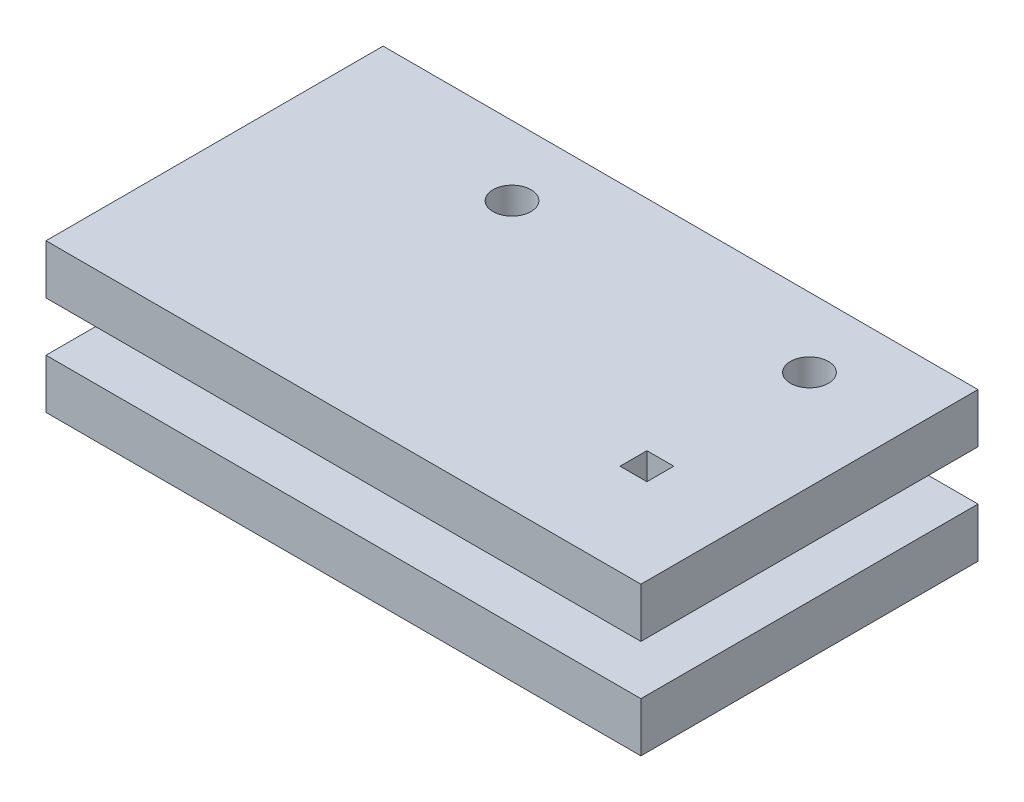
ISO-10303-21;
HEADER;
FILE_DESCRIPTION(('STEP AP214'),'2;1');
FILE_NAME('part.step','',(''),(''),'','','');
FILE_SCHEMA(('AUTOMOTIVE_DESIGN { 1 0 10303 214 1 1 1 1 }'));
ENDSEC;
DATA;
#1=APPLICATION_CONTEXT('core data for automotive mechanical design processes');
#2=APPLICATION_PROTOCOL_DEFINITION('international standard','automotive_design',2000,#1);
#3=PRODUCT_CONTEXT('',#1,'mechanical');
#4=PRODUCT('Part','Part','',(#3));
#5=PRODUCT_RELATED_PRODUCT_CATEGORY('part','',(#4));
#6=PRODUCT_DEFINITION_FORMATION('','',#4);
#7=PRODUCT_DEFINITION_CONTEXT('part definition',#1,'design');
#8=PRODUCT_DEFINITION('design','',#6,#7);
#9=PRODUCT_DEFINITION_SHAPE('','',#8);
#10=(LENGTH_UNIT() NAMED_UNIT(*) SI_UNIT(.MILLI.,.METRE.));
#11=(NAMED_UNIT(*) PLANE_ANGLE_UNIT() SI_UNIT($,.RADIAN.));
#12=(NAMED_UNIT(*) SI_UNIT($,.STERADIAN.) SOLID_ANGLE_UNIT());
#13=UNCERTAINTY_MEASURE_WITH_UNIT(LENGTH_MEASURE(1.E-05),#10,'distance_accuracy_value','');
#14=(GEOMETRIC_REPRESENTATION_CONTEXT(3) GLOBAL_UNCERTAINTY_ASSIGNED_CONTEXT((#13)) GLOBAL_UNIT_ASSIGNED_CONTEXT((#10,
#11,#12)) REPRESENTATION_CONTEXT('',''));
#15=CARTESIAN_POINT('',(0.,0.,0.));
#16=DIRECTION('',(0.,0.,1.));
#17=DIRECTION('',(1.,0.,0.));
#18=AXIS2_PLACEMENT_3D('',#15,#16,#17);
#19=CARTESIAN_POINT('',(38.1,9.525,43.18));
#20=DIRECTION('',(-1.,0.,0.));
#21=DIRECTION('',(0.,-1.,0.));
#22=AXIS2_PLACEMENT_3D('',#19,#20,#21);
#23=PLANE('',#22);
#24=DIRECTION('',(0.,1.,0.));
#25=VECTOR('',#24,1.);
#26=CARTESIAN_POINT('',(38.1,9.525,0.));
#27=LINE('',#26,#25);
#28=CARTESIAN_POINT('',(38.1,-9.525,0.));
#29=VERTEX_POINT('',#28);
#30=CARTESIAN_POINT('',(38.1,-3.175,0.));
#31=VERTEX_POINT('',#30);
#32=EDGE_CURVE('E151',#29,#31,#27,.T.);
#33=ORIENTED_EDGE('',*,*,#32,.T.);
#34=DIRECTION('',(0.,0.,-1.));
#35=VECTOR('',#34,1.);
#36=CARTESIAN_POINT('',(38.1,-3.175,43.18));
#37=LINE('',#36,#35);
#38=CARTESIAN_POINT('',(38.1,-3.175,43.18));
#39=VERTEX_POINT('',#38);
#40=EDGE_CURVE('E166',#39,#31,#37,.T.);
#41=ORIENTED_EDGE('',*,*,#40,.F.);
#42=DIRECTION('',(0.,1.,0.));
#43=VECTOR('',#42,1.);
#44=CARTESIAN_POINT('',(38.1,9.525,43.18));
#45=LINE('',#44,#43);
#46=CARTESIAN_POINT('',(38.1,-9.525,43.18));
#47=VERTEX_POINT('',#46);
#48=EDGE_CURVE('E162',#47,#39,#45,.T.);
#49=ORIENTED_EDGE('',*,*,#48,.F.);
#50=DIRECTION('',(0.,0.,-1.));
#51=VECTOR('',#50,1.);
#52=CARTESIAN_POINT('',(38.1,-9.525,43.18));
#53=LINE('',#52,#51);
#54=EDGE_CURVE('E157',#47,#29,#53,.T.);
#55=ORIENTED_EDGE('',*,*,#54,.T.);
#56=EDGE_LOOP('',(#33,#41,#49,#55));
#57=FACE_BOUND('',#56,.T.);
#58=ADVANCED_FACE('F55',(#57),#23,.F.);
#59=CARTESIAN_POINT('',(-38.1,9.525,43.18));
#60=DIRECTION('',(1.,0.,0.));
#61=DIRECTION('',(0.,1.,0.));
#62=AXIS2_PLACEMENT_3D('',#59,#60,#61);
#63=PLANE('',#62);
#64=DIRECTION('',(0.,-1.,0.));
#65=VECTOR('',#64,1.);
#66=CARTESIAN_POINT('',(-38.1,9.525,43.18));
#67=LINE('',#66,#65);
#68=CARTESIAN_POINT('',(-38.1,-3.175,43.18));
#69=VERTEX_POINT('',#68);
#70=CARTESIAN_POINT('',(-38.1,-9.525,43.18));
#71=VERTEX_POINT('',#70);
#72=EDGE_CURVE('E165',#69,#71,#67,.T.);
#73=ORIENTED_EDGE('',*,*,#72,.F.);
#74=DIRECTION('',(0.,0.,-1.));
#75=VECTOR('',#74,1.);
#76=CARTESIAN_POINT('',(-38.1,-3.175,43.18));
#77=LINE('',#76,#75);
#78=CARTESIAN_POINT('',(-38.1,-3.175,0.));
#79=VERTEX_POINT('',#78);
#80=EDGE_CURVE('E160',#69,#79,#77,.T.);
#81=ORIENTED_EDGE('',*,*,#80,.T.);
#82=DIRECTION('',(0.,-1.,0.));
#83=VECTOR('',#82,1.);
#84=CARTESIAN_POINT('',(-38.1,9.525,0.));
#85=LINE('',#84,#83);
#86=CARTESIAN_POINT('',(-38.1,-9.525,0.));
#87=VERTEX_POINT('',#86);
#88=EDGE_CURVE('E171',#79,#87,#85,.T.);
#89=ORIENTED_EDGE('',*,*,#88,.T.);
#90=DIRECTION('',(0.,0.,-1.));
#91=VECTOR('',#90,1.);
#92=CARTESIAN_POINT('',(-38.1,-9.525,43.18));
#93=LINE('',#92,#91);
#94=EDGE_CURVE('E152',#71,#87,#93,.T.);
#95=ORIENTED_EDGE('',*,*,#94,.F.);
#96=EDGE_LOOP('',(#73,#81,#89,#95));
#97=FACE_BOUND('',#96,.T.);
#98=ADVANCED_FACE('F214',(#97),#63,.F.);
#99=CARTESIAN_POINT('',(0.,0.,43.18));
#100=DIRECTION('',(0.,0.,1.));
#101=DIRECTION('',(1.,0.,0.));
#102=AXIS2_PLACEMENT_3D('',#99,#100,#101);
#103=PLANE('',#102);
#104=DIRECTION('',(-1.,0.,0.));
#105=VECTOR('',#104,1.);
#106=CARTESIAN_POINT('',(38.1,-3.175,43.18));
#107=LINE('',#106,#105);
#108=EDGE_CURVE('E173',#39,#69,#107,.T.);
#109=ORIENTED_EDGE('',*,*,#108,.T.);
#110=ORIENTED_EDGE('',*,*,#72,.T.);
#111=DIRECTION('',(1.,0.,0.));
#112=VECTOR('',#111,1.);
#113=CARTESIAN_POINT('',(-38.1,-9.525,43.18));
#114=LINE('',#113,#112);
#115=EDGE_CURVE('E163',#71,#47,#114,.T.);
#116=ORIENTED_EDGE('',*,*,#115,.T.);
#117=ORIENTED_EDGE('',*,*,#48,.T.);
#118=EDGE_LOOP('',(#109,#110,#116,#117));
#119=FACE_BOUND('',#118,.T.);
#120=ADVANCED_FACE('F209',(#119),#103,.T.);
#121=CARTESIAN_POINT('',(0.,0.,0.));
#122=DIRECTION('',(0.,0.,1.));
#123=DIRECTION('',(1.,0.,0.));
#124=AXIS2_PLACEMENT_3D('',#121,#122,#123);
#125=PLANE('',#124);
#126=ORIENTED_EDGE('',*,*,#88,.F.);
#127=DIRECTION('',(-1.,0.,0.));
#128=VECTOR('',#127,1.);
#129=CARTESIAN_POINT('',(38.1,-3.175,0.));
#130=LINE('',#129,#128);
#131=EDGE_CURVE('E155',#31,#79,#130,.T.);
#132=ORIENTED_EDGE('',*,*,#131,.F.);
#133=ORIENTED_EDGE('',*,*,#32,.F.);
#134=DIRECTION('',(1.,0.,0.));
#135=VECTOR('',#134,1.);
#136=CARTESIAN_POINT('',(-38.1,-9.525,0.));
#137=LINE('',#136,#135);
#138=EDGE_CURVE('E156',#87,#29,#137,.T.);
#139=ORIENTED_EDGE('',*,*,#138,.F.);
#140=EDGE_LOOP('',(#126,#132,#133,#139));
#141=FACE_BOUND('',#140,.T.);
#142=ADVANCED_FACE('F199',(#141),#125,.F.);
#143=CARTESIAN_POINT('',(-38.1,-9.525,43.18));
#144=DIRECTION('',(0.,1.,0.));
#145=DIRECTION('',(0.,0.,1.));
#146=AXIS2_PLACEMENT_3D('',#143,#144,#145);
#147=PLANE('',#146);
#148=CARTESIAN_POINT('',(25.4,-9.525,8.89000000000003));
#149=DIRECTION('',(0.,1.,0.));
#150=DIRECTION('',(0.,0.,1.));
#151=AXIS2_PLACEMENT_3D('',#148,#149,#150);
#152=CIRCLE('',#151,2.434895054);
#153=CARTESIAN_POINT('',(25.4,-9.525,6.45510494600003));
#154=VERTEX_POINT('',#153);
#155=EDGE_CURVE('E148',#154,#154,#152,.T.);
#156=ORIENTED_EDGE('',*,*,#155,.T.);
#157=EDGE_LOOP('',(#156));
#158=FACE_BOUND('',#157,.T.);
#159=CARTESIAN_POINT('',(-12.7,-9.525,8.89000000000003));
#160=DIRECTION('',(0.,1.,0.));
#161=DIRECTION('',(0.,0.,1.));
#162=AXIS2_PLACEMENT_3D('',#159,#160,#161);
#163=CIRCLE('',#162,2.434895054);
#164=CARTESIAN_POINT('',(-12.7,-9.525,6.45510494600003));
#165=VERTEX_POINT('',#164);
#166=EDGE_CURVE('E145',#165,#165,#163,.T.);
#167=ORIENTED_EDGE('',*,*,#166,.T.);
#168=EDGE_LOOP('',(#167));
#169=FACE_BOUND('',#168,.T.);
#170=DIRECTION('',(1.,0.,0.));
#171=VECTOR('',#170,1.);
#172=CARTESIAN_POINT('',(-38.1,-9.525,31.4294513951733));
#173=LINE('',#172,#171);
#174=CARTESIAN_POINT('',(23.6782693754441,-9.52499999999999,31.4294513951733));
#175=VERTEX_POINT('',#174);
#176=CARTESIAN_POINT('',(27.1217306245559,-9.525,31.4294513951733));
#177=VERTEX_POINT('',#176);
#178=EDGE_CURVE('E118',#175,#177,#173,.T.);
#179=ORIENTED_EDGE('',*,*,#178,.T.);
#180=DIRECTION('',(0.,0.,-1.));
#181=VECTOR('',#180,1.);
#182=CARTESIAN_POINT('',(27.1217306245559,-9.525,43.18));
#183=LINE('',#182,#181);
#184=CARTESIAN_POINT('',(27.1217306245559,-9.52499999999999,27.9859901460616));
#185=VERTEX_POINT('',#184);
#186=EDGE_CURVE('E139',#177,#185,#183,.T.);
#187=ORIENTED_EDGE('',*,*,#186,.T.);
#188=DIRECTION('',(-1.,0.,0.));
#189=VECTOR('',#188,1.);
#190=CARTESIAN_POINT('',(-38.1,-9.525,27.9859901460616));
#191=LINE('',#190,#189);
#192=CARTESIAN_POINT('',(23.6782693754441,-9.52499999999999,27.9859901460616));
#193=VERTEX_POINT('',#192);
#194=EDGE_CURVE('E137',#185,#193,#191,.T.);
#195=ORIENTED_EDGE('',*,*,#194,.T.);
#196=DIRECTION('',(0.,0.,1.));
#197=VECTOR('',#196,1.);
#198=CARTESIAN_POINT('',(23.6782693754441,-9.525,43.18));
#199=LINE('',#198,#197);
#200=EDGE_CURVE('E123',#193,#175,#199,.T.);
#201=ORIENTED_EDGE('',*,*,#200,.T.);
#202=EDGE_LOOP('',(#179,#187,#195,#201));
#203=FACE_BOUND('',#202,.T.);
#204=ORIENTED_EDGE('',*,*,#138,.T.);
#205=ORIENTED_EDGE('',*,*,#54,.F.);
#206=ORIENTED_EDGE('',*,*,#115,.F.);
#207=ORIENTED_EDGE('',*,*,#94,.T.);
#208=EDGE_LOOP('',(#204,#205,#206,#207));
#209=FACE_BOUND('',#208,.T.);
#210=ADVANCED_FACE('F135',(#158,#169,#203,#209),#147,.F.);
#211=CARTESIAN_POINT('',(38.1,-3.175,43.18));
#212=DIRECTION('',(0.,-1.,0.));
#213=DIRECTION('',(0.,0.,-1.));
#214=AXIS2_PLACEMENT_3D('',#211,#212,#213);
#215=PLANE('',#214);
#216=CARTESIAN_POINT('',(25.4,-3.175,8.89000000000003));
#217=DIRECTION('',(0.,-1.,0.));
#218=DIRECTION('',(0.,0.,-1.));
#219=AXIS2_PLACEMENT_3D('',#216,#217,#218);
#220=CIRCLE('',#219,2.434895054);
#221=CARTESIAN_POINT('',(25.4,-3.175,6.45510494600003));
#222=VERTEX_POINT('',#221);
#223=EDGE_CURVE('E58',#222,#222,#220,.T.);
#224=ORIENTED_EDGE('',*,*,#223,.T.);
#225=EDGE_LOOP('',(#224));
#226=FACE_BOUND('',#225,.T.);
#227=CARTESIAN_POINT('',(-12.7,-3.175,8.89000000000003));
#228=DIRECTION('',(0.,-1.,0.));
#229=DIRECTION('',(0.,0.,-1.));
#230=AXIS2_PLACEMENT_3D('',#227,#228,#229);
#231=CIRCLE('',#230,2.434895054);
#232=CARTESIAN_POINT('',(-12.7,-3.175,6.45510494600003));
#233=VERTEX_POINT('',#232);
#234=EDGE_CURVE('E144',#233,#233,#231,.T.);
#235=ORIENTED_EDGE('',*,*,#234,.T.);
#236=EDGE_LOOP('',(#235));
#237=FACE_BOUND('',#236,.T.);
#238=DIRECTION('',(1.,0.,0.));
#239=VECTOR('',#238,1.);
#240=CARTESIAN_POINT('',(38.1,-3.175,27.9859901460616));
#241=LINE('',#240,#239);
#242=CARTESIAN_POINT('',(23.6782693754441,-3.175,27.9859901460616));
#243=VERTEX_POINT('',#242);
#244=CARTESIAN_POINT('',(27.1217306245559,-3.175,27.9859901460616));
#245=VERTEX_POINT('',#244);
#246=EDGE_CURVE('E63',#243,#245,#241,.T.);
#247=ORIENTED_EDGE('',*,*,#246,.T.);
#248=DIRECTION('',(0.,0.,1.));
#249=VECTOR('',#248,1.);
#250=CARTESIAN_POINT('',(27.1217306245559,-3.175,43.18));
#251=LINE('',#250,#249);
#252=CARTESIAN_POINT('',(27.1217306245559,-3.175,31.4294513951733));
#253=VERTEX_POINT('',#252);
#254=EDGE_CURVE('E12',#245,#253,#251,.T.);
#255=ORIENTED_EDGE('',*,*,#254,.T.);
#256=DIRECTION('',(-1.,0.,0.));
#257=VECTOR('',#256,1.);
#258=CARTESIAN_POINT('',(38.1,-3.175,31.4294513951733));
#259=LINE('',#258,#257);
#260=CARTESIAN_POINT('',(23.6782693754441,-3.175,31.4294513951733));
#261=VERTEX_POINT('',#260);
#262=EDGE_CURVE('E168',#253,#261,#259,.T.);
#263=ORIENTED_EDGE('',*,*,#262,.T.);
#264=DIRECTION('',(0.,0.,-1.));
#265=VECTOR('',#264,1.);
#266=CARTESIAN_POINT('',(23.6782693754441,-3.175,43.18));
#267=LINE('',#266,#265);
#268=EDGE_CURVE('E130',#261,#243,#267,.T.);
#269=ORIENTED_EDGE('',*,*,#268,.T.);
#270=EDGE_LOOP('',(#247,#255,#263,#269));
#271=FACE_BOUND('',#270,.T.);
#272=ORIENTED_EDGE('',*,*,#131,.T.);
#273=ORIENTED_EDGE('',*,*,#80,.F.);
#274=ORIENTED_EDGE('',*,*,#108,.F.);
#275=ORIENTED_EDGE('',*,*,#40,.T.);
#276=EDGE_LOOP('',(#272,#273,#274,#275));
#277=FACE_BOUND('',#276,.T.);
#278=ADVANCED_FACE('F188',(#226,#237,#271,#277),#215,.F.);
#279=CARTESIAN_POINT('',(27.1217306245559,9.525,27.9859901460616));
#280=DIRECTION('',(1.,0.,0.));
#281=DIRECTION('',(0.,0.,-1.));
#282=AXIS2_PLACEMENT_3D('',#279,#280,#281);
#283=PLANE('',#282);
#284=DIRECTION('',(0.,-1.,0.));
#285=VECTOR('',#284,1.);
#286=CARTESIAN_POINT('',(27.1217306245559,9.525,31.4294513951733));
#287=LINE('',#286,#285);
#288=EDGE_CURVE('E71',#253,#177,#287,.T.);
#289=ORIENTED_EDGE('',*,*,#288,.F.);
#290=ORIENTED_EDGE('',*,*,#254,.F.);
#291=DIRECTION('',(0.,-1.,0.));
#292=VECTOR('',#291,1.);
#293=CARTESIAN_POINT('',(27.1217306245559,9.525,27.9859901460616));
#294=LINE('',#293,#292);
#295=EDGE_CURVE('E311',#245,#185,#294,.T.);
#296=ORIENTED_EDGE('',*,*,#295,.T.);
#297=ORIENTED_EDGE('',*,*,#186,.F.);
#298=EDGE_LOOP('',(#289,#290,#296,#297));
#299=FACE_BOUND('',#298,.T.);
#300=ADVANCED_FACE('F206',(#299),#283,.F.);
#301=CARTESIAN_POINT('',(23.6782693754441,9.525,27.9859901460616));
#302=DIRECTION('',(0.,0.,-1.));
#303=DIRECTION('',(-1.,0.,0.));
#304=AXIS2_PLACEMENT_3D('',#301,#302,#303);
#305=PLANE('',#304);
#306=ORIENTED_EDGE('',*,*,#295,.F.);
#307=ORIENTED_EDGE('',*,*,#246,.F.);
#308=DIRECTION('',(0.,-1.,0.));
#309=VECTOR('',#308,1.);
#310=CARTESIAN_POINT('',(23.6782693754441,9.525,27.9859901460616));
#311=LINE('',#310,#309);
#312=EDGE_CURVE('E132',#243,#193,#311,.T.);
#313=ORIENTED_EDGE('',*,*,#312,.T.);
#314=ORIENTED_EDGE('',*,*,#194,.F.);
#315=EDGE_LOOP('',(#306,#307,#313,#314));
#316=FACE_BOUND('',#315,.T.);
#317=ADVANCED_FACE('F260',(#316),#305,.F.);
#318=CARTESIAN_POINT('',(23.6782693754441,9.525,27.9859901460616));
#319=DIRECTION('',(-1.,0.,0.));
#320=DIRECTION('',(0.,0.,1.));
#321=AXIS2_PLACEMENT_3D('',#318,#319,#320);
#322=PLANE('',#321);
#323=ORIENTED_EDGE('',*,*,#312,.F.);
#324=ORIENTED_EDGE('',*,*,#268,.F.);
#325=DIRECTION('',(0.,-1.,0.));
#326=VECTOR('',#325,1.);
#327=CARTESIAN_POINT('',(23.6782693754441,9.525,31.4294513951733));
#328=LINE('',#327,#326);
#329=EDGE_CURVE('E76',#261,#175,#328,.T.);
#330=ORIENTED_EDGE('',*,*,#329,.T.);
#331=ORIENTED_EDGE('',*,*,#200,.F.);
#332=EDGE_LOOP('',(#323,#324,#330,#331));
#333=FACE_BOUND('',#332,.T.);
#334=ADVANCED_FACE('F127',(#333),#322,.F.);
#335=CARTESIAN_POINT('',(23.6782693754441,9.525,31.4294513951733));
#336=DIRECTION('',(0.,0.,1.));
#337=DIRECTION('',(1.,0.,0.));
#338=AXIS2_PLACEMENT_3D('',#335,#336,#337);
#339=PLANE('',#338);
#340=ORIENTED_EDGE('',*,*,#329,.F.);
#341=ORIENTED_EDGE('',*,*,#262,.F.);
#342=ORIENTED_EDGE('',*,*,#288,.T.);
#343=ORIENTED_EDGE('',*,*,#178,.F.);
#344=EDGE_LOOP('',(#340,#341,#342,#343));
#345=FACE_BOUND('',#344,.T.);
#346=ADVANCED_FACE('F119',(#345),#339,.F.);
#347=CARTESIAN_POINT('',(-12.7,9.525,8.89000000000003));
#348=DIRECTION('',(0.,-1.,0.));
#349=DIRECTION('',(0.,0.,-1.));
#350=AXIS2_PLACEMENT_3D('',#347,#348,#349);
#351=CYLINDRICAL_SURFACE('',#350,2.434895054);
#352=CARTESIAN_POINT('',(-12.7,-3.175,6.45510494600003));
#353=CARTESIAN_POINT('',(-12.7,-3.24114583333333,6.45510494600003));
#354=CARTESIAN_POINT('',(-12.7,-3.30729166666666,6.45510494600003));
#355=CARTESIAN_POINT('',(-12.7,-3.43958333333333,6.45510494600003));
#356=CARTESIAN_POINT('',(-12.7,-3.50572916666666,6.45510494600003));
#357=CARTESIAN_POINT('',(-12.7,-3.63802083333333,6.45510494600003));
#358=CARTESIAN_POINT('',(-12.7,-3.70416666666666,6.45510494600003));
#359=CARTESIAN_POINT('',(-12.7,-3.83645833333333,6.45510494600003));
#360=CARTESIAN_POINT('',(-12.7,-3.90260416666666,6.45510494600003));
#361=CARTESIAN_POINT('',(-12.7,-4.03489583333333,6.45510494600003));
#362=CARTESIAN_POINT('',(-12.7,-4.10104166666666,6.45510494600003));
#363=CARTESIAN_POINT('',(-12.7,-4.23333333333333,6.45510494600003));
#364=CARTESIAN_POINT('',(-12.7,-4.29947916666666,6.45510494600003));
#365=CARTESIAN_POINT('',(-12.7,-4.43177083333333,6.45510494600003));
#366=CARTESIAN_POINT('',(-12.7,-4.49791666666666,6.45510494600003));
#367=CARTESIAN_POINT('',(-12.7,-4.63020833333333,6.45510494600003));
#368=CARTESIAN_POINT('',(-12.7,-4.69635416666666,6.45510494600003));
#369=CARTESIAN_POINT('',(-12.7,-4.82864583333333,6.45510494600003));
#370=CARTESIAN_POINT('',(-12.7,-4.89479166666666,6.45510494600003));
#371=CARTESIAN_POINT('',(-12.7,-5.02708333333333,6.45510494600003));
#372=CARTESIAN_POINT('',(-12.7,-5.09322916666666,6.45510494600003));
#373=CARTESIAN_POINT('',(-12.7,-5.22552083333333,6.45510494600003));
#374=CARTESIAN_POINT('',(-12.7,-5.29166666666666,6.45510494600003));
#375=CARTESIAN_POINT('',(-12.7,-5.42395833333333,6.45510494600003));
#376=CARTESIAN_POINT('',(-12.7,-5.49010416666667,6.45510494600003));
#377=CARTESIAN_POINT('',(-12.7,-5.62239583333333,6.45510494600003));
#378=CARTESIAN_POINT('',(-12.7,-5.68854166666666,6.45510494600003));
#379=CARTESIAN_POINT('',(-12.7,-5.82083333333333,6.45510494600003));
#380=CARTESIAN_POINT('',(-12.7,-5.88697916666666,6.45510494600003));
#381=CARTESIAN_POINT('',(-12.7,-6.01927083333333,6.45510494600003));
#382=CARTESIAN_POINT('',(-12.7,-6.08541666666666,6.45510494600003));
#383=CARTESIAN_POINT('',(-12.7,-6.21770833333333,6.45510494600003));
#384=CARTESIAN_POINT('',(-12.7,-6.28385416666666,6.45510494600003));
#385=CARTESIAN_POINT('',(-12.7,-6.41614583333333,6.45510494600003));
#386=CARTESIAN_POINT('',(-12.7,-6.48229166666666,6.45510494600003));
#387=CARTESIAN_POINT('',(-12.7,-6.61458333333333,6.45510494600003));
#388=CARTESIAN_POINT('',(-12.7,-6.68072916666666,6.45510494600003));
#389=CARTESIAN_POINT('',(-12.7,-6.81302083333333,6.45510494600003));
#390=CARTESIAN_POINT('',(-12.7,-6.87916666666666,6.45510494600003));
#391=CARTESIAN_POINT('',(-12.7,-7.01145833333333,6.45510494600003));
#392=CARTESIAN_POINT('',(-12.7,-7.07760416666666,6.45510494600003));
#393=CARTESIAN_POINT('',(-12.7,-7.20989583333333,6.45510494600003));
#394=CARTESIAN_POINT('',(-12.7,-7.27604166666666,6.45510494600003));
#395=CARTESIAN_POINT('',(-12.7,-7.40833333333333,6.45510494600003));
#396=CARTESIAN_POINT('',(-12.7,-7.47447916666666,6.45510494600003));
#397=CARTESIAN_POINT('',(-12.7,-7.60677083333333,6.45510494600003));
#398=CARTESIAN_POINT('',(-12.7,-7.67291666666666,6.45510494600003));
#399=CARTESIAN_POINT('',(-12.7,-7.80520833333333,6.45510494600003));
#400=CARTESIAN_POINT('',(-12.7,-7.87135416666666,6.45510494600003));
#401=CARTESIAN_POINT('',(-12.7,-8.00364583333333,6.45510494600003));
#402=CARTESIAN_POINT('',(-12.7,-8.06979166666666,6.45510494600003));
#403=CARTESIAN_POINT('',(-12.7,-8.20208333333333,6.45510494600003));
#404=CARTESIAN_POINT('',(-12.7,-8.26822916666666,6.45510494600003));
#405=CARTESIAN_POINT('',(-12.7,-8.40052083333333,6.45510494600003));
#406=CARTESIAN_POINT('',(-12.7,-8.46666666666666,6.45510494600003));
#407=CARTESIAN_POINT('',(-12.7,-8.59895833333333,6.45510494600003));
#408=CARTESIAN_POINT('',(-12.7,-8.66510416666666,6.45510494600003));
#409=CARTESIAN_POINT('',(-12.7,-8.79739583333333,6.45510494600003));
#410=CARTESIAN_POINT('',(-12.7,-8.86354166666666,6.45510494600003));
#411=CARTESIAN_POINT('',(-12.7,-8.99583333333333,6.45510494600003));
#412=CARTESIAN_POINT('',(-12.7,-9.06197916666666,6.45510494600003));
#413=CARTESIAN_POINT('',(-12.7,-9.19427083333333,6.45510494600003));
#414=CARTESIAN_POINT('',(-12.7,-9.26041666666666,6.45510494600003));
#415=CARTESIAN_POINT('',(-12.7,-9.39270833333333,6.45510494600003));
#416=CARTESIAN_POINT('',(-12.7,-9.45885416666666,6.45510494600003));
#417=CARTESIAN_POINT('',(-12.7,-9.525,6.45510494600003));
#418=B_SPLINE_CURVE_WITH_KNOTS('',3,(#352,#353,#354,#355,#356,#357,#358,#359,#360,#361,#362,
#363,#364,#365,#366,#367,#368,#369,#370,#371,#372,#373,#374,#375,#376,#377,#378,#379,#380,#381,
#382,#383,#384,#385,#386,#387,#388,#389,#390,#391,#392,#393,#394,#395,#396,#397,#398,#399,#400,
#401,#402,#403,#404,#405,#406,#407,#408,#409,#410,#411,#412,#413,#414,#415,#416,#417),
.UNSPECIFIED.,.F.,.F.,(4,2,2,2,2,2,2,2,2,2,2,2,2,2,2,2,2,2,2,2,2,2,2,2,2,2,2,2,2,2,2,2,4),(0.,
0.198437500000001,0.396875,0.5953125,0.793749999999999,0.9921875,1.190625,1.3890625,1.5875,
1.7859375,1.984375,2.1828125,2.38125,2.5796875,2.778125,2.9765625,3.175,3.3734375,3.571875,
3.7703125,3.96875,4.1671875,4.365625,4.5640625,4.7625,4.9609375,5.159375,5.3578125,5.55625,
5.7546875,5.953125,6.1515625,6.35),.UNSPECIFIED.);
#419=EDGE_CURVE('BSEAM191',#233,#165,#418,.T.);
#420=ORIENTED_EDGE('',*,*,#234,.F.);
#421=ORIENTED_EDGE('',*,*,#166,.F.);
#422=ORIENTED_EDGE('',*,*,#419,.T.);
#423=ORIENTED_EDGE('',*,*,#419,.F.);
#424=EDGE_LOOP('',(#420,#422,#421,#423));
#425=FACE_BOUND('',#424,.T.);
#426=ADVANCED_FACE('F191',(#425),#351,.F.);
#427=CARTESIAN_POINT('',(25.4,9.525,8.89000000000003));
#428=DIRECTION('',(0.,-1.,0.));
#429=DIRECTION('',(0.,0.,-1.));
#430=AXIS2_PLACEMENT_3D('',#427,#428,#429);
#431=CYLINDRICAL_SURFACE('',#430,2.434895054);
#432=CARTESIAN_POINT('',(25.4,-3.175,6.45510494600003));
#433=CARTESIAN_POINT('',(25.4,-3.24114583333333,6.45510494600003));
#434=CARTESIAN_POINT('',(25.4,-3.30729166666666,6.45510494600003));
#435=CARTESIAN_POINT('',(25.4,-3.43958333333333,6.45510494600003));
#436=CARTESIAN_POINT('',(25.4,-3.50572916666666,6.45510494600003));
#437=CARTESIAN_POINT('',(25.4,-3.63802083333333,6.45510494600003));
#438=CARTESIAN_POINT('',(25.4,-3.70416666666666,6.45510494600003));
#439=CARTESIAN_POINT('',(25.4,-3.83645833333333,6.45510494600003));
#440=CARTESIAN_POINT('',(25.4,-3.90260416666666,6.45510494600003));
#441=CARTESIAN_POINT('',(25.4,-4.03489583333333,6.45510494600003));
#442=CARTESIAN_POINT('',(25.4,-4.10104166666666,6.45510494600003));
#443=CARTESIAN_POINT('',(25.4,-4.23333333333333,6.45510494600003));
#444=CARTESIAN_POINT('',(25.4,-4.29947916666666,6.45510494600003));
#445=CARTESIAN_POINT('',(25.4,-4.43177083333333,6.45510494600003));
#446=CARTESIAN_POINT('',(25.4,-4.49791666666666,6.45510494600003));
#447=CARTESIAN_POINT('',(25.4,-4.63020833333333,6.45510494600003));
#448=CARTESIAN_POINT('',(25.4,-4.69635416666666,6.45510494600003));
#449=CARTESIAN_POINT('',(25.4,-4.82864583333333,6.45510494600003));
#450=CARTESIAN_POINT('',(25.4,-4.89479166666666,6.45510494600003));
#451=CARTESIAN_POINT('',(25.4,-5.02708333333333,6.45510494600003));
#452=CARTESIAN_POINT('',(25.4,-5.09322916666666,6.45510494600003));
#453=CARTESIAN_POINT('',(25.4,-5.22552083333333,6.45510494600003));
#454=CARTESIAN_POINT('',(25.4,-5.29166666666666,6.45510494600003));
#455=CARTESIAN_POINT('',(25.4,-5.42395833333333,6.45510494600003));
#456=CARTESIAN_POINT('',(25.4,-5.49010416666667,6.45510494600003));
#457=CARTESIAN_POINT('',(25.4,-5.62239583333333,6.45510494600003));
#458=CARTESIAN_POINT('',(25.4,-5.68854166666666,6.45510494600003));
#459=CARTESIAN_POINT('',(25.4,-5.82083333333333,6.45510494600003));
#460=CARTESIAN_POINT('',(25.4,-5.88697916666666,6.45510494600003));
#461=CARTESIAN_POINT('',(25.4,-6.01927083333333,6.45510494600003));
#462=CARTESIAN_POINT('',(25.4,-6.08541666666666,6.45510494600003));
#463=CARTESIAN_POINT('',(25.4,-6.21770833333333,6.45510494600003));
#464=CARTESIAN_POINT('',(25.4,-6.28385416666666,6.45510494600003));
#465=CARTESIAN_POINT('',(25.4,-6.41614583333333,6.45510494600003));
#466=CARTESIAN_POINT('',(25.4,-6.48229166666666,6.45510494600003));
#467=CARTESIAN_POINT('',(25.4,-6.61458333333333,6.45510494600003));
#468=CARTESIAN_POINT('',(25.4,-6.68072916666666,6.45510494600003));
#469=CARTESIAN_POINT('',(25.4,-6.81302083333333,6.45510494600003));
#470=CARTESIAN_POINT('',(25.4,-6.87916666666666,6.45510494600003));
#471=CARTESIAN_POINT('',(25.4,-7.01145833333333,6.45510494600003));
#472=CARTESIAN_POINT('',(25.4,-7.07760416666666,6.45510494600003));
#473=CARTESIAN_POINT('',(25.4,-7.20989583333333,6.45510494600003));
#474=CARTESIAN_POINT('',(25.4,-7.27604166666666,6.45510494600003));
#475=CARTESIAN_POINT('',(25.4,-7.40833333333333,6.45510494600003));
#476=CARTESIAN_POINT('',(25.4,-7.47447916666666,6.45510494600003));
#477=CARTESIAN_POINT('',(25.4,-7.60677083333333,6.45510494600003));
#478=CARTESIAN_POINT('',(25.4,-7.67291666666666,6.45510494600003));
#479=CARTESIAN_POINT('',(25.4,-7.80520833333333,6.45510494600003));
#480=CARTESIAN_POINT('',(25.4,-7.87135416666666,6.45510494600003));
#481=CARTESIAN_POINT('',(25.4,-8.00364583333333,6.45510494600003));
#482=CARTESIAN_POINT('',(25.4,-8.06979166666666,6.45510494600003));
#483=CARTESIAN_POINT('',(25.4,-8.20208333333333,6.45510494600003));
#484=CARTESIAN_POINT('',(25.4,-8.26822916666666,6.45510494600003));
#485=CARTESIAN_POINT('',(25.4,-8.40052083333333,6.45510494600003));
#486=CARTESIAN_POINT('',(25.4,-8.46666666666666,6.45510494600003));
#487=CARTESIAN_POINT('',(25.4,-8.59895833333333,6.45510494600003));
#488=CARTESIAN_POINT('',(25.4,-8.66510416666666,6.45510494600003));
#489=CARTESIAN_POINT('',(25.4,-8.79739583333333,6.45510494600003));
#490=CARTESIAN_POINT('',(25.4,-8.86354166666666,6.45510494600003));
#491=CARTESIAN_POINT('',(25.4,-8.99583333333333,6.45510494600003));
#492=CARTESIAN_POINT('',(25.4,-9.06197916666666,6.45510494600003));
#493=CARTESIAN_POINT('',(25.4,-9.19427083333333,6.45510494600003));
#494=CARTESIAN_POINT('',(25.4,-9.26041666666666,6.45510494600003));
#495=CARTESIAN_POINT('',(25.4,-9.39270833333333,6.45510494600003));
#496=CARTESIAN_POINT('',(25.4,-9.45885416666666,6.45510494600003));
#497=CARTESIAN_POINT('',(25.4,-9.525,6.45510494600003));
#498=B_SPLINE_CURVE_WITH_KNOTS('',3,(#432,#433,#434,#435,#436,#437,#438,#439,#440,#441,#442,
#443,#444,#445,#446,#447,#448,#449,#450,#451,#452,#453,#454,#455,#456,#457,#458,#459,#460,#461,
#462,#463,#464,#465,#466,#467,#468,#469,#470,#471,#472,#473,#474,#475,#476,#477,#478,#479,#480,
#481,#482,#483,#484,#485,#486,#487,#488,#489,#490,#491,#492,#493,#494,#495,#496,#497),
.UNSPECIFIED.,.F.,.F.,(4,2,2,2,2,2,2,2,2,2,2,2,2,2,2,2,2,2,2,2,2,2,2,2,2,2,2,2,2,2,2,2,4),(0.,
0.198437500000001,0.396875,0.5953125,0.793749999999999,0.9921875,1.190625,1.3890625,1.5875,
1.7859375,1.984375,2.1828125,2.38125,2.5796875,2.778125,2.9765625,3.175,3.3734375,3.571875,
3.7703125,3.96875,4.1671875,4.365625,4.5640625,4.7625,4.9609375,5.159375,5.3578125,5.55625,
5.7546875,5.953125,6.1515625,6.35),.UNSPECIFIED.);
#499=EDGE_CURVE('BSEAM194',#222,#154,#498,.T.);
#500=ORIENTED_EDGE('',*,*,#223,.F.);
#501=ORIENTED_EDGE('',*,*,#155,.F.);
#502=ORIENTED_EDGE('',*,*,#499,.T.);
#503=ORIENTED_EDGE('',*,*,#499,.F.);
#504=EDGE_LOOP('',(#500,#502,#501,#503));
#505=FACE_BOUND('',#504,.T.);
#506=ADVANCED_FACE('F194',(#505),#431,.F.);
#507=CLOSED_SHELL('',(#58,#98,#120,#142,#210,#278,#300,#317,#334,#346,#426,#506));
#508=MANIFOLD_SOLID_BREP('B2',#507);
#509=CARTESIAN_POINT('',(-38.1,9.525,43.18));
#510=DIRECTION('',(0.,-1.,0.));
#511=DIRECTION('',(0.,0.,-1.));
#512=AXIS2_PLACEMENT_3D('',#509,#510,#511);
#513=PLANE('',#512);
#514=CARTESIAN_POINT('',(25.4,9.525,8.89000000000003));
#515=DIRECTION('',(0.,-1.,0.));
#516=DIRECTION('',(0.,0.,-1.));
#517=AXIS2_PLACEMENT_3D('',#514,#515,#516);
#518=CIRCLE('',#517,2.434895054);
#519=CARTESIAN_POINT('',(25.4,9.525,6.45510494600003));
#520=VERTEX_POINT('',#519);
#521=EDGE_CURVE('E482',#520,#520,#518,.T.);
#522=ORIENTED_EDGE('',*,*,#521,.T.);
#523=EDGE_LOOP('',(#522));
#524=FACE_BOUND('',#523,.T.);
#525=CARTESIAN_POINT('',(-12.7,9.525,8.89000000000003));
#526=DIRECTION('',(0.,-1.,0.));
#527=DIRECTION('',(0.,0.,-1.));
#528=AXIS2_PLACEMENT_3D('',#525,#526,#527);
#529=CIRCLE('',#528,2.434895054);
#530=CARTESIAN_POINT('',(-12.7,9.525,6.45510494600003));
#531=VERTEX_POINT('',#530);
#532=EDGE_CURVE('E413',#531,#531,#529,.T.);
#533=ORIENTED_EDGE('',*,*,#532,.T.);
#534=EDGE_LOOP('',(#533));
#535=FACE_BOUND('',#534,.T.);
#536=DIRECTION('',(1.,0.,0.));
#537=VECTOR('',#536,1.);
#538=CARTESIAN_POINT('',(23.6782693754441,9.525,27.9859901460616));
#539=LINE('',#538,#537);
#540=CARTESIAN_POINT('',(23.6782693754441,9.525,27.9859901460616));
#541=VERTEX_POINT('',#540);
#542=CARTESIAN_POINT('',(27.1217306245559,9.525,27.9859901460616));
#543=VERTEX_POINT('',#542);
#544=EDGE_CURVE('E401',#541,#543,#539,.T.);
#545=ORIENTED_EDGE('',*,*,#544,.T.);
#546=DIRECTION('',(0.,0.,1.));
#547=VECTOR('',#546,1.);
#548=CARTESIAN_POINT('',(27.1217306245559,9.525,27.9859901460616));
#549=LINE('',#548,#547);
#550=CARTESIAN_POINT('',(27.1217306245559,9.525,31.4294513951733));
#551=VERTEX_POINT('',#550);
#552=EDGE_CURVE('E408',#543,#551,#549,.T.);
#553=ORIENTED_EDGE('',*,*,#552,.T.);
#554=DIRECTION('',(-1.,0.,0.));
#555=VECTOR('',#554,1.);
#556=CARTESIAN_POINT('',(23.6782693754441,9.525,31.4294513951733));
#557=LINE('',#556,#555);
#558=CARTESIAN_POINT('',(23.6782693754441,9.525,31.4294513951733));
#559=VERTEX_POINT('',#558);
#560=EDGE_CURVE('E414',#551,#559,#557,.T.);
#561=ORIENTED_EDGE('',*,*,#560,.T.);
#562=DIRECTION('',(0.,0.,-1.));
#563=VECTOR('',#562,1.);
#564=CARTESIAN_POINT('',(23.6782693754441,9.525,27.9859901460616));
#565=LINE('',#564,#563);
#566=EDGE_CURVE('E345',#559,#541,#565,.T.);
#567=ORIENTED_EDGE('',*,*,#566,.T.);
#568=EDGE_LOOP('',(#545,#553,#561,#567));
#569=FACE_BOUND('',#568,.T.);
#570=DIRECTION('',(-1.,0.,0.));
#571=VECTOR('',#570,1.);
#572=CARTESIAN_POINT('',(-38.1,9.525,0.));
#573=LINE('',#572,#571);
#574=CARTESIAN_POINT('',(38.1,9.525,0.));
#575=VERTEX_POINT('',#574);
#576=CARTESIAN_POINT('',(-38.1,9.525,0.));
#577=VERTEX_POINT('',#576);
#578=EDGE_CURVE('E457',#575,#577,#573,.T.);
#579=ORIENTED_EDGE('',*,*,#578,.T.);
#580=DIRECTION('',(0.,0.,-1.));
#581=VECTOR('',#580,1.);
#582=CARTESIAN_POINT('',(-38.1,9.525,43.18));
#583=LINE('',#582,#581);
#584=CARTESIAN_POINT('',(-38.1,9.525,43.18));
#585=VERTEX_POINT('',#584);
#586=EDGE_CURVE('E454',#585,#577,#583,.T.);
#587=ORIENTED_EDGE('',*,*,#586,.F.);
#588=DIRECTION('',(-1.,0.,0.));
#589=VECTOR('',#588,1.);
#590=CARTESIAN_POINT('',(-38.1,9.525,43.18));
#591=LINE('',#590,#589);
#592=CARTESIAN_POINT('',(38.1,9.525,43.18));
#593=VERTEX_POINT('',#592);
#594=EDGE_CURVE('E446',#593,#585,#591,.T.);
#595=ORIENTED_EDGE('',*,*,#594,.F.);
#596=DIRECTION('',(0.,0.,-1.));
#597=VECTOR('',#596,1.);
#598=CARTESIAN_POINT('',(38.1,9.525,43.18));
#599=LINE('',#598,#597);
#600=EDGE_CURVE('E466',#593,#575,#599,.T.);
#601=ORIENTED_EDGE('',*,*,#600,.T.);
#602=EDGE_LOOP('',(#579,#587,#595,#601));
#603=FACE_BOUND('',#602,.T.);
#604=ADVANCED_FACE('F327',(#524,#535,#569,#603),#513,.F.);
#605=CARTESIAN_POINT('',(0.,0.,43.18));
#606=DIRECTION('',(0.,0.,1.));
#607=DIRECTION('',(1.,0.,0.));
#608=AXIS2_PLACEMENT_3D('',#605,#606,#607);
#609=PLANE('',#608);
#610=DIRECTION('',(1.,0.,0.));
#611=VECTOR('',#610,1.);
#612=CARTESIAN_POINT('',(38.1,3.175,43.18));
#613=LINE('',#612,#611);
#614=CARTESIAN_POINT('',(-38.1,3.175,43.18));
#615=VERTEX_POINT('',#614);
#616=CARTESIAN_POINT('',(38.1,3.175,43.18));
#617=VERTEX_POINT('',#616);
#618=EDGE_CURVE('E428',#615,#617,#613,.T.);
#619=ORIENTED_EDGE('',*,*,#618,.T.);
#620=DIRECTION('',(0.,1.,0.));
#621=VECTOR('',#620,1.);
#622=CARTESIAN_POINT('',(38.1,9.525,43.18));
#623=LINE('',#622,#621);
#624=EDGE_CURVE('E443',#617,#593,#623,.T.);
#625=ORIENTED_EDGE('',*,*,#624,.T.);
#626=ORIENTED_EDGE('',*,*,#594,.T.);
#627=DIRECTION('',(0.,-1.,0.));
#628=VECTOR('',#627,1.);
#629=CARTESIAN_POINT('',(-38.1,9.525,43.18));
#630=LINE('',#629,#628);
#631=EDGE_CURVE('E450',#585,#615,#630,.T.);
#632=ORIENTED_EDGE('',*,*,#631,.T.);
#633=EDGE_LOOP('',(#619,#625,#626,#632));
#634=FACE_BOUND('',#633,.T.);
#635=ADVANCED_FACE('F513',(#634),#609,.T.);
#636=CARTESIAN_POINT('',(0.,0.,0.));
#637=DIRECTION('',(0.,0.,1.));
#638=DIRECTION('',(1.,0.,0.));
#639=AXIS2_PLACEMENT_3D('',#636,#637,#638);
#640=PLANE('',#639);
#641=DIRECTION('',(0.,1.,0.));
#642=VECTOR('',#641,1.);
#643=CARTESIAN_POINT('',(38.1,9.525,0.));
#644=LINE('',#643,#642);
#645=CARTESIAN_POINT('',(38.1,3.175,0.));
#646=VERTEX_POINT('',#645);
#647=EDGE_CURVE('E440',#646,#575,#644,.T.);
#648=ORIENTED_EDGE('',*,*,#647,.F.);
#649=DIRECTION('',(1.,0.,0.));
#650=VECTOR('',#649,1.);
#651=CARTESIAN_POINT('',(38.1,3.175,0.));
#652=LINE('',#651,#650);
#653=CARTESIAN_POINT('',(-38.1,3.175,0.));
#654=VERTEX_POINT('',#653);
#655=EDGE_CURVE('E433',#654,#646,#652,.T.);
#656=ORIENTED_EDGE('',*,*,#655,.F.);
#657=DIRECTION('',(0.,-1.,0.));
#658=VECTOR('',#657,1.);
#659=CARTESIAN_POINT('',(-38.1,9.525,0.));
#660=LINE('',#659,#658);
#661=EDGE_CURVE('E447',#577,#654,#660,.T.);
#662=ORIENTED_EDGE('',*,*,#661,.F.);
#663=ORIENTED_EDGE('',*,*,#578,.F.);
#664=EDGE_LOOP('',(#648,#656,#662,#663));
#665=FACE_BOUND('',#664,.T.);
#666=ADVANCED_FACE('F519',(#665),#640,.F.);
#667=CARTESIAN_POINT('',(-38.1,9.525,43.18));
#668=DIRECTION('',(1.,0.,0.));
#669=DIRECTION('',(0.,1.,0.));
#670=AXIS2_PLACEMENT_3D('',#667,#668,#669);
#671=PLANE('',#670);
#672=ORIENTED_EDGE('',*,*,#661,.T.);
#673=DIRECTION('',(0.,0.,-1.));
#674=VECTOR('',#673,1.);
#675=CARTESIAN_POINT('',(-38.1,3.175,43.18));
#676=LINE('',#675,#674);
#677=EDGE_CURVE('E432',#615,#654,#676,.T.);
#678=ORIENTED_EDGE('',*,*,#677,.F.);
#679=ORIENTED_EDGE('',*,*,#631,.F.);
#680=ORIENTED_EDGE('',*,*,#586,.T.);
#681=EDGE_LOOP('',(#672,#678,#679,#680));
#682=FACE_BOUND('',#681,.T.);
#683=ADVANCED_FACE('F524',(#682),#671,.F.);
#684=CARTESIAN_POINT('',(38.1,9.525,43.18));
#685=DIRECTION('',(-1.,0.,0.));
#686=DIRECTION('',(0.,-1.,0.));
#687=AXIS2_PLACEMENT_3D('',#684,#685,#686);
#688=PLANE('',#687);
#689=ORIENTED_EDGE('',*,*,#624,.F.);
#690=DIRECTION('',(0.,0.,-1.));
#691=VECTOR('',#690,1.);
#692=CARTESIAN_POINT('',(38.1,3.175,43.18));
#693=LINE('',#692,#691);
#694=EDGE_CURVE('E436',#617,#646,#693,.T.);
#695=ORIENTED_EDGE('',*,*,#694,.T.);
#696=ORIENTED_EDGE('',*,*,#647,.T.);
#697=ORIENTED_EDGE('',*,*,#600,.F.);
#698=EDGE_LOOP('',(#689,#695,#696,#697));
#699=FACE_BOUND('',#698,.T.);
#700=ADVANCED_FACE('F329',(#699),#688,.F.);
#701=CARTESIAN_POINT('',(38.1,3.175,43.18));
#702=DIRECTION('',(0.,1.,0.));
#703=DIRECTION('',(0.,0.,1.));
#704=AXIS2_PLACEMENT_3D('',#701,#702,#703);
#705=PLANE('',#704);
#706=CARTESIAN_POINT('',(25.4,3.175,8.89000000000003));
#707=DIRECTION('',(0.,1.,0.));
#708=DIRECTION('',(0.,0.,1.));
#709=AXIS2_PLACEMENT_3D('',#706,#707,#708);
#710=CIRCLE('',#709,2.434895054);
#711=CARTESIAN_POINT('',(25.4,3.175,6.45510494600003));
#712=VERTEX_POINT('',#711);
#713=EDGE_CURVE('E331',#712,#712,#710,.T.);
#714=ORIENTED_EDGE('',*,*,#713,.T.);
#715=EDGE_LOOP('',(#714));
#716=FACE_BOUND('',#715,.T.);
#717=CARTESIAN_POINT('',(-12.7,3.175,8.89000000000003));
#718=DIRECTION('',(0.,1.,0.));
#719=DIRECTION('',(0.,0.,1.));
#720=AXIS2_PLACEMENT_3D('',#717,#718,#719);
#721=CIRCLE('',#720,2.434895054);
#722=CARTESIAN_POINT('',(-12.7,3.175,6.45510494600003));
#723=VERTEX_POINT('',#722);
#724=EDGE_CURVE('E479',#723,#723,#721,.T.);
#725=ORIENTED_EDGE('',*,*,#724,.T.);
#726=EDGE_LOOP('',(#725));
#727=FACE_BOUND('',#726,.T.);
#728=DIRECTION('',(1.,0.,0.));
#729=VECTOR('',#728,1.);
#730=CARTESIAN_POINT('',(38.1,3.175,31.4294513951733));
#731=LINE('',#730,#729);
#732=CARTESIAN_POINT('',(23.6782693754441,3.175,31.4294513951733));
#733=VERTEX_POINT('',#732);
#734=CARTESIAN_POINT('',(27.1217306245559,3.175,31.4294513951733));
#735=VERTEX_POINT('',#734);
#736=EDGE_CURVE('E470',#733,#735,#731,.T.);
#737=ORIENTED_EDGE('',*,*,#736,.T.);
#738=DIRECTION('',(0.,0.,-1.));
#739=VECTOR('',#738,1.);
#740=CARTESIAN_POINT('',(27.1217306245559,3.175,43.18));
#741=LINE('',#740,#739);
#742=CARTESIAN_POINT('',(27.1217306245559,3.175,27.9859901460616));
#743=VERTEX_POINT('',#742);
#744=EDGE_CURVE('E53',#735,#743,#741,.T.);
#745=ORIENTED_EDGE('',*,*,#744,.T.);
#746=DIRECTION('',(-1.,0.,0.));
#747=VECTOR('',#746,1.);
#748=CARTESIAN_POINT('',(38.1,3.175,27.9859901460616));
#749=LINE('',#748,#747);
#750=CARTESIAN_POINT('',(23.6782693754441,3.175,27.9859901460616));
#751=VERTEX_POINT('',#750);
#752=EDGE_CURVE('E337',#743,#751,#749,.T.);
#753=ORIENTED_EDGE('',*,*,#752,.T.);
#754=DIRECTION('',(0.,0.,1.));
#755=VECTOR('',#754,1.);
#756=CARTESIAN_POINT('',(23.6782693754441,3.175,43.18));
#757=LINE('',#756,#755);
#758=EDGE_CURVE('E474',#751,#733,#757,.T.);
#759=ORIENTED_EDGE('',*,*,#758,.T.);
#760=EDGE_LOOP('',(#737,#745,#753,#759));
#761=FACE_BOUND('',#760,.T.);
#762=ORIENTED_EDGE('',*,*,#655,.T.);
#763=ORIENTED_EDGE('',*,*,#694,.F.);
#764=ORIENTED_EDGE('',*,*,#618,.F.);
#765=ORIENTED_EDGE('',*,*,#677,.T.);
#766=EDGE_LOOP('',(#762,#763,#764,#765));
#767=FACE_BOUND('',#766,.T.);
#768=ADVANCED_FACE('F499',(#716,#727,#761,#767),#705,.F.);
#769=CARTESIAN_POINT('',(27.1217306245559,9.525,27.9859901460616));
#770=DIRECTION('',(1.,0.,0.));
#771=DIRECTION('',(0.,0.,-1.));
#772=AXIS2_PLACEMENT_3D('',#769,#770,#771);
#773=PLANE('',#772);
#774=DIRECTION('',(0.,-1.,0.));
#775=VECTOR('',#774,1.);
#776=CARTESIAN_POINT('',(27.1217306245559,9.525,31.4294513951733));
#777=LINE('',#776,#775);
#778=EDGE_CURVE('E353',#551,#735,#777,.T.);
#779=ORIENTED_EDGE('',*,*,#778,.F.);
#780=ORIENTED_EDGE('',*,*,#552,.F.);
#781=DIRECTION('',(0.,-1.,0.));
#782=VECTOR('',#781,1.);
#783=CARTESIAN_POINT('',(27.1217306245559,9.525,27.9859901460616));
#784=LINE('',#783,#782);
#785=EDGE_CURVE('E396',#543,#743,#784,.T.);
#786=ORIENTED_EDGE('',*,*,#785,.T.);
#787=ORIENTED_EDGE('',*,*,#744,.F.);
#788=EDGE_LOOP('',(#779,#780,#786,#787));
#789=FACE_BOUND('',#788,.T.);
#790=ADVANCED_FACE('F409',(#789),#773,.F.);
#791=CARTESIAN_POINT('',(23.6782693754441,9.525,27.9859901460616));
#792=DIRECTION('',(0.,0.,-1.));
#793=DIRECTION('',(-1.,0.,0.));
#794=AXIS2_PLACEMENT_3D('',#791,#792,#793);
#795=PLANE('',#794);
#796=ORIENTED_EDGE('',*,*,#785,.F.);
#797=ORIENTED_EDGE('',*,*,#544,.F.);
#798=DIRECTION('',(0.,-1.,0.));
#799=VECTOR('',#798,1.);
#800=CARTESIAN_POINT('',(23.6782693754441,9.525,27.9859901460616));
#801=LINE('',#800,#799);
#802=EDGE_CURVE('E405',#541,#751,#801,.T.);
#803=ORIENTED_EDGE('',*,*,#802,.T.);
#804=ORIENTED_EDGE('',*,*,#752,.F.);
#805=EDGE_LOOP('',(#796,#797,#803,#804));
#806=FACE_BOUND('',#805,.T.);
#807=ADVANCED_FACE('F398',(#806),#795,.F.);
#808=CARTESIAN_POINT('',(23.6782693754441,9.525,27.9859901460616));
#809=DIRECTION('',(-1.,0.,0.));
#810=DIRECTION('',(0.,0.,1.));
#811=AXIS2_PLACEMENT_3D('',#808,#809,#810);
#812=PLANE('',#811);
#813=ORIENTED_EDGE('',*,*,#802,.F.);
#814=ORIENTED_EDGE('',*,*,#566,.F.);
#815=DIRECTION('',(0.,-1.,0.));
#816=VECTOR('',#815,1.);
#817=CARTESIAN_POINT('',(23.6782693754441,9.525,31.4294513951733));
#818=LINE('',#817,#816);
#819=EDGE_CURVE('E422',#559,#733,#818,.T.);
#820=ORIENTED_EDGE('',*,*,#819,.T.);
#821=ORIENTED_EDGE('',*,*,#758,.F.);
#822=EDGE_LOOP('',(#813,#814,#820,#821));
#823=FACE_BOUND('',#822,.T.);
#824=ADVANCED_FACE('F502',(#823),#812,.F.);
#825=CARTESIAN_POINT('',(23.6782693754441,9.525,31.4294513951733));
#826=DIRECTION('',(0.,0.,1.));
#827=DIRECTION('',(1.,0.,0.));
#828=AXIS2_PLACEMENT_3D('',#825,#826,#827);
#829=PLANE('',#828);
#830=ORIENTED_EDGE('',*,*,#819,.F.);
#831=ORIENTED_EDGE('',*,*,#560,.F.);
#832=ORIENTED_EDGE('',*,*,#778,.T.);
#833=ORIENTED_EDGE('',*,*,#736,.F.);
#834=EDGE_LOOP('',(#830,#831,#832,#833));
#835=FACE_BOUND('',#834,.T.);
#836=ADVANCED_FACE('F501',(#835),#829,.F.);
#837=CARTESIAN_POINT('',(-12.7,9.525,8.89000000000003));
#838=DIRECTION('',(0.,-1.,0.));
#839=DIRECTION('',(0.,0.,-1.));
#840=AXIS2_PLACEMENT_3D('',#837,#838,#839);
#841=CYLINDRICAL_SURFACE('',#840,2.434895054);
#842=CARTESIAN_POINT('',(-12.7,9.525,6.45510494600003));
#843=CARTESIAN_POINT('',(-12.7,9.45885416666667,6.45510494600003));
#844=CARTESIAN_POINT('',(-12.7,9.39270833333334,6.45510494600003));
#845=CARTESIAN_POINT('',(-12.7,9.26041666666667,6.45510494600003));
#846=CARTESIAN_POINT('',(-12.7,9.19427083333334,6.45510494600003));
#847=CARTESIAN_POINT('',(-12.7,9.06197916666667,6.45510494600003));
#848=CARTESIAN_POINT('',(-12.7,8.99583333333334,6.45510494600003));
#849=CARTESIAN_POINT('',(-12.7,8.86354166666667,6.45510494600003));
#850=CARTESIAN_POINT('',(-12.7,8.79739583333334,6.45510494600003));
#851=CARTESIAN_POINT('',(-12.7,8.66510416666667,6.45510494600003));
#852=CARTESIAN_POINT('',(-12.7,8.59895833333334,6.45510494600003));
#853=CARTESIAN_POINT('',(-12.7,8.46666666666667,6.45510494600003));
#854=CARTESIAN_POINT('',(-12.7,8.40052083333334,6.45510494600003));
#855=CARTESIAN_POINT('',(-12.7,8.26822916666667,6.45510494600003));
#856=CARTESIAN_POINT('',(-12.7,8.20208333333334,6.45510494600003));
#857=CARTESIAN_POINT('',(-12.7,8.06979166666667,6.45510494600003));
#858=CARTESIAN_POINT('',(-12.7,8.00364583333334,6.45510494600003));
#859=CARTESIAN_POINT('',(-12.7,7.87135416666667,6.45510494600003));
#860=CARTESIAN_POINT('',(-12.7,7.80520833333334,6.45510494600003));
#861=CARTESIAN_POINT('',(-12.7,7.67291666666667,6.45510494600003));
#862=CARTESIAN_POINT('',(-12.7,7.60677083333334,6.45510494600003));
#863=CARTESIAN_POINT('',(-12.7,7.47447916666667,6.45510494600003));
#864=CARTESIAN_POINT('',(-12.7,7.40833333333334,6.45510494600003));
#865=CARTESIAN_POINT('',(-12.7,7.27604166666667,6.45510494600003));
#866=CARTESIAN_POINT('',(-12.7,7.20989583333334,6.45510494600003));
#867=CARTESIAN_POINT('',(-12.7,7.07760416666667,6.45510494600003));
#868=CARTESIAN_POINT('',(-12.7,7.01145833333334,6.45510494600003));
#869=CARTESIAN_POINT('',(-12.7,6.87916666666667,6.45510494600003));
#870=CARTESIAN_POINT('',(-12.7,6.81302083333334,6.45510494600003));
#871=CARTESIAN_POINT('',(-12.7,6.68072916666667,6.45510494600003));
#872=CARTESIAN_POINT('',(-12.7,6.61458333333334,6.45510494600003));
#873=CARTESIAN_POINT('',(-12.7,6.48229166666667,6.45510494600003));
#874=CARTESIAN_POINT('',(-12.7,6.41614583333333,6.45510494600003));
#875=CARTESIAN_POINT('',(-12.7,6.28385416666667,6.45510494600003));
#876=CARTESIAN_POINT('',(-12.7,6.21770833333334,6.45510494600003));
#877=CARTESIAN_POINT('',(-12.7,6.08541666666667,6.45510494600003));
#878=CARTESIAN_POINT('',(-12.7,6.01927083333334,6.45510494600003));
#879=CARTESIAN_POINT('',(-12.7,5.88697916666667,6.45510494600003));
#880=CARTESIAN_POINT('',(-12.7,5.82083333333333,6.45510494600003));
#881=CARTESIAN_POINT('',(-12.7,5.68854166666667,6.45510494600003));
#882=CARTESIAN_POINT('',(-12.7,5.62239583333333,6.45510494600003));
#883=CARTESIAN_POINT('',(-12.7,5.49010416666667,6.45510494600003));
#884=CARTESIAN_POINT('',(-12.7,5.42395833333333,6.45510494600003));
#885=CARTESIAN_POINT('',(-12.7,5.29166666666667,6.45510494600003));
#886=CARTESIAN_POINT('',(-12.7,5.22552083333333,6.45510494600003));
#887=CARTESIAN_POINT('',(-12.7,5.09322916666667,6.45510494600003));
#888=CARTESIAN_POINT('',(-12.7,5.02708333333333,6.45510494600003));
#889=CARTESIAN_POINT('',(-12.7,4.89479166666667,6.45510494600003));
#890=CARTESIAN_POINT('',(-12.7,4.82864583333333,6.45510494600003));
#891=CARTESIAN_POINT('',(-12.7,4.69635416666667,6.45510494600003));
#892=CARTESIAN_POINT('',(-12.7,4.63020833333333,6.45510494600003));
#893=CARTESIAN_POINT('',(-12.7,4.49791666666667,6.45510494600003));
#894=CARTESIAN_POINT('',(-12.7,4.43177083333333,6.45510494600003));
#895=CARTESIAN_POINT('',(-12.7,4.29947916666667,6.45510494600003));
#896=CARTESIAN_POINT('',(-12.7,4.23333333333333,6.45510494600003));
#897=CARTESIAN_POINT('',(-12.7,4.10104166666667,6.45510494600003));
#898=CARTESIAN_POINT('',(-12.7,4.03489583333333,6.45510494600003));
#899=CARTESIAN_POINT('',(-12.7,3.90260416666667,6.45510494600003));
#900=CARTESIAN_POINT('',(-12.7,3.83645833333333,6.45510494600003));
#901=CARTESIAN_POINT('',(-12.7,3.70416666666667,6.45510494600003));
#902=CARTESIAN_POINT('',(-12.7,3.63802083333333,6.45510494600003));
#903=CARTESIAN_POINT('',(-12.7,3.50572916666667,6.45510494600003));
#904=CARTESIAN_POINT('',(-12.7,3.43958333333333,6.45510494600003));
#905=CARTESIAN_POINT('',(-12.7,3.30729166666667,6.45510494600003));
#906=CARTESIAN_POINT('',(-12.7,3.24114583333333,6.45510494600003));
#907=CARTESIAN_POINT('',(-12.7,3.175,6.45510494600003));
#908=B_SPLINE_CURVE_WITH_KNOTS('',3,(#842,#843,#844,#845,#846,#847,#848,#849,#850,#851,#852,
#853,#854,#855,#856,#857,#858,#859,#860,#861,#862,#863,#864,#865,#866,#867,#868,#869,#870,#871,
#872,#873,#874,#875,#876,#877,#878,#879,#880,#881,#882,#883,#884,#885,#886,#887,#888,#889,#890,
#891,#892,#893,#894,#895,#896,#897,#898,#899,#900,#901,#902,#903,#904,#905,#906,#907),
.UNSPECIFIED.,.F.,.F.,(4,2,2,2,2,2,2,2,2,2,2,2,2,2,2,2,2,2,2,2,2,2,2,2,2,2,2,2,2,2,2,2,4),(0.,
0.198437499999999,0.396875,0.5953125,0.793749999999999,0.9921875,1.190625,1.3890625,1.5875,
1.7859375,1.984375,2.1828125,2.38125,2.5796875,2.778125,2.9765625,3.175,3.3734375,3.571875,
3.7703125,3.96875,4.1671875,4.365625,4.5640625,4.7625,4.9609375,5.159375,5.3578125,5.55625,
5.7546875,5.953125,6.1515625,6.35),.UNSPECIFIED.);
#909=EDGE_CURVE('BSEAM509',#531,#723,#908,.T.);
#910=ORIENTED_EDGE('',*,*,#532,.F.);
#911=ORIENTED_EDGE('',*,*,#724,.F.);
#912=ORIENTED_EDGE('',*,*,#909,.T.);
#913=ORIENTED_EDGE('',*,*,#909,.F.);
#914=EDGE_LOOP('',(#910,#912,#911,#913));
#915=FACE_BOUND('',#914,.T.);
#916=ADVANCED_FACE('F509',(#915),#841,.F.);
#917=CARTESIAN_POINT('',(25.4,9.525,8.89000000000003));
#918=DIRECTION('',(0.,-1.,0.));
#919=DIRECTION('',(0.,0.,-1.));
#920=AXIS2_PLACEMENT_3D('',#917,#918,#919);
#921=CYLINDRICAL_SURFACE('',#920,2.434895054);
#922=CARTESIAN_POINT('',(25.4,9.525,6.45510494600003));
#923=CARTESIAN_POINT('',(25.4,9.45885416666667,6.45510494600003));
#924=CARTESIAN_POINT('',(25.4,9.39270833333334,6.45510494600003));
#925=CARTESIAN_POINT('',(25.4,9.26041666666667,6.45510494600003));
#926=CARTESIAN_POINT('',(25.4,9.19427083333334,6.45510494600003));
#927=CARTESIAN_POINT('',(25.4,9.06197916666667,6.45510494600003));
#928=CARTESIAN_POINT('',(25.4,8.99583333333334,6.45510494600003));
#929=CARTESIAN_POINT('',(25.4,8.86354166666667,6.45510494600003));
#930=CARTESIAN_POINT('',(25.4,8.79739583333334,6.45510494600003));
#931=CARTESIAN_POINT('',(25.4,8.66510416666667,6.45510494600003));
#932=CARTESIAN_POINT('',(25.4,8.59895833333334,6.45510494600003));
#933=CARTESIAN_POINT('',(25.4,8.46666666666667,6.45510494600003));
#934=CARTESIAN_POINT('',(25.4,8.40052083333334,6.45510494600003));
#935=CARTESIAN_POINT('',(25.4,8.26822916666667,6.45510494600003));
#936=CARTESIAN_POINT('',(25.4,8.20208333333334,6.45510494600003));
#937=CARTESIAN_POINT('',(25.4,8.06979166666667,6.45510494600003));
#938=CARTESIAN_POINT('',(25.4,8.00364583333334,6.45510494600003));
#939=CARTESIAN_POINT('',(25.4,7.87135416666667,6.45510494600003));
#940=CARTESIAN_POINT('',(25.4,7.80520833333334,6.45510494600003));
#941=CARTESIAN_POINT('',(25.4,7.67291666666667,6.45510494600003));
#942=CARTESIAN_POINT('',(25.4,7.60677083333334,6.45510494600003));
#943=CARTESIAN_POINT('',(25.4,7.47447916666667,6.45510494600003));
#944=CARTESIAN_POINT('',(25.4,7.40833333333334,6.45510494600003));
#945=CARTESIAN_POINT('',(25.4,7.27604166666667,6.45510494600003));
#946=CARTESIAN_POINT('',(25.4,7.20989583333334,6.45510494600003));
#947=CARTESIAN_POINT('',(25.4,7.07760416666667,6.45510494600003));
#948=CARTESIAN_POINT('',(25.4,7.01145833333334,6.45510494600003));
#949=CARTESIAN_POINT('',(25.4,6.87916666666667,6.45510494600003));
#950=CARTESIAN_POINT('',(25.4,6.81302083333334,6.45510494600003));
#951=CARTESIAN_POINT('',(25.4,6.68072916666667,6.45510494600003));
#952=CARTESIAN_POINT('',(25.4,6.61458333333334,6.45510494600003));
#953=CARTESIAN_POINT('',(25.4,6.48229166666667,6.45510494600003));
#954=CARTESIAN_POINT('',(25.4,6.41614583333333,6.45510494600003));
#955=CARTESIAN_POINT('',(25.4,6.28385416666667,6.45510494600003));
#956=CARTESIAN_POINT('',(25.4,6.21770833333334,6.45510494600003));
#957=CARTESIAN_POINT('',(25.4,6.08541666666667,6.45510494600003));
#958=CARTESIAN_POINT('',(25.4,6.01927083333334,6.45510494600003));
#959=CARTESIAN_POINT('',(25.4,5.88697916666667,6.45510494600003));
#960=CARTESIAN_POINT('',(25.4,5.82083333333333,6.45510494600003));
#961=CARTESIAN_POINT('',(25.4,5.68854166666667,6.45510494600003));
#962=CARTESIAN_POINT('',(25.4,5.62239583333333,6.45510494600003));
#963=CARTESIAN_POINT('',(25.4,5.49010416666667,6.45510494600003));
#964=CARTESIAN_POINT('',(25.4,5.42395833333333,6.45510494600003));
#965=CARTESIAN_POINT('',(25.4,5.29166666666667,6.45510494600003));
#966=CARTESIAN_POINT('',(25.4,5.22552083333333,6.45510494600003));
#967=CARTESIAN_POINT('',(25.4,5.09322916666667,6.45510494600003));
#968=CARTESIAN_POINT('',(25.4,5.02708333333333,6.45510494600003));
#969=CARTESIAN_POINT('',(25.4,4.89479166666667,6.45510494600003));
#970=CARTESIAN_POINT('',(25.4,4.82864583333333,6.45510494600003));
#971=CARTESIAN_POINT('',(25.4,4.69635416666667,6.45510494600003));
#972=CARTESIAN_POINT('',(25.4,4.63020833333333,6.45510494600003));
#973=CARTESIAN_POINT('',(25.4,4.49791666666667,6.45510494600003));
#974=CARTESIAN_POINT('',(25.4,4.43177083333333,6.45510494600003));
#975=CARTESIAN_POINT('',(25.4,4.29947916666667,6.45510494600003));
#976=CARTESIAN_POINT('',(25.4,4.23333333333333,6.45510494600003));
#977=CARTESIAN_POINT('',(25.4,4.10104166666667,6.45510494600003));
#978=CARTESIAN_POINT('',(25.4,4.03489583333333,6.45510494600003));
#979=CARTESIAN_POINT('',(25.4,3.90260416666667,6.45510494600003));
#980=CARTESIAN_POINT('',(25.4,3.83645833333333,6.45510494600003));
#981=CARTESIAN_POINT('',(25.4,3.70416666666667,6.45510494600003));
#982=CARTESIAN_POINT('',(25.4,3.63802083333333,6.45510494600003));
#983=CARTESIAN_POINT('',(25.4,3.50572916666667,6.45510494600003));
#984=CARTESIAN_POINT('',(25.4,3.43958333333333,6.45510494600003));
#985=CARTESIAN_POINT('',(25.4,3.30729166666667,6.45510494600003));
#986=CARTESIAN_POINT('',(25.4,3.24114583333333,6.45510494600003));
#987=CARTESIAN_POINT('',(25.4,3.175,6.45510494600003));
#988=B_SPLINE_CURVE_WITH_KNOTS('',3,(#922,#923,#924,#925,#926,#927,#928,#929,#930,#931,#932,
#933,#934,#935,#936,#937,#938,#939,#940,#941,#942,#943,#944,#945,#946,#947,#948,#949,#950,#951,
#952,#953,#954,#955,#956,#957,#958,#959,#960,#961,#962,#963,#964,#965,#966,#967,#968,#969,#970,
#971,#972,#973,#974,#975,#976,#977,#978,#979,#980,#981,#982,#983,#984,#985,#986,#987),
.UNSPECIFIED.,.F.,.F.,(4,2,2,2,2,2,2,2,2,2,2,2,2,2,2,2,2,2,2,2,2,2,2,2,2,2,2,2,2,2,2,2,4),(0.,
0.198437499999999,0.396875,0.5953125,0.793749999999999,0.9921875,1.190625,1.3890625,1.5875,
1.7859375,1.984375,2.1828125,2.38125,2.5796875,2.778125,2.9765625,3.175,3.3734375,3.571875,
3.7703125,3.96875,4.1671875,4.365625,4.5640625,4.7625,4.9609375,5.159375,5.3578125,5.55625,
5.7546875,5.953125,6.1515625,6.35),.UNSPECIFIED.);
#989=EDGE_CURVE('BSEAM539',#520,#712,#988,.T.);
#990=ORIENTED_EDGE('',*,*,#521,.F.);
#991=ORIENTED_EDGE('',*,*,#713,.F.);
#992=ORIENTED_EDGE('',*,*,#989,.T.);
#993=ORIENTED_EDGE('',*,*,#989,.F.);
#994=EDGE_LOOP('',(#990,#992,#991,#993));
#995=FACE_BOUND('',#994,.T.);
#996=ADVANCED_FACE('F539',(#995),#921,.F.);
#997=CLOSED_SHELL('',(#604,#635,#666,#683,#700,#768,#790,#807,#824,#836,#916,#996));
#998=MANIFOLD_SOLID_BREP('B6',#997);
#999=ADVANCED_BREP_SHAPE_REPRESENTATION('',(#18,#508,#998),#14);
#1000=SHAPE_DEFINITION_REPRESENTATION(#9,#999);
ENDSEC;
END-ISO-10303-21;
